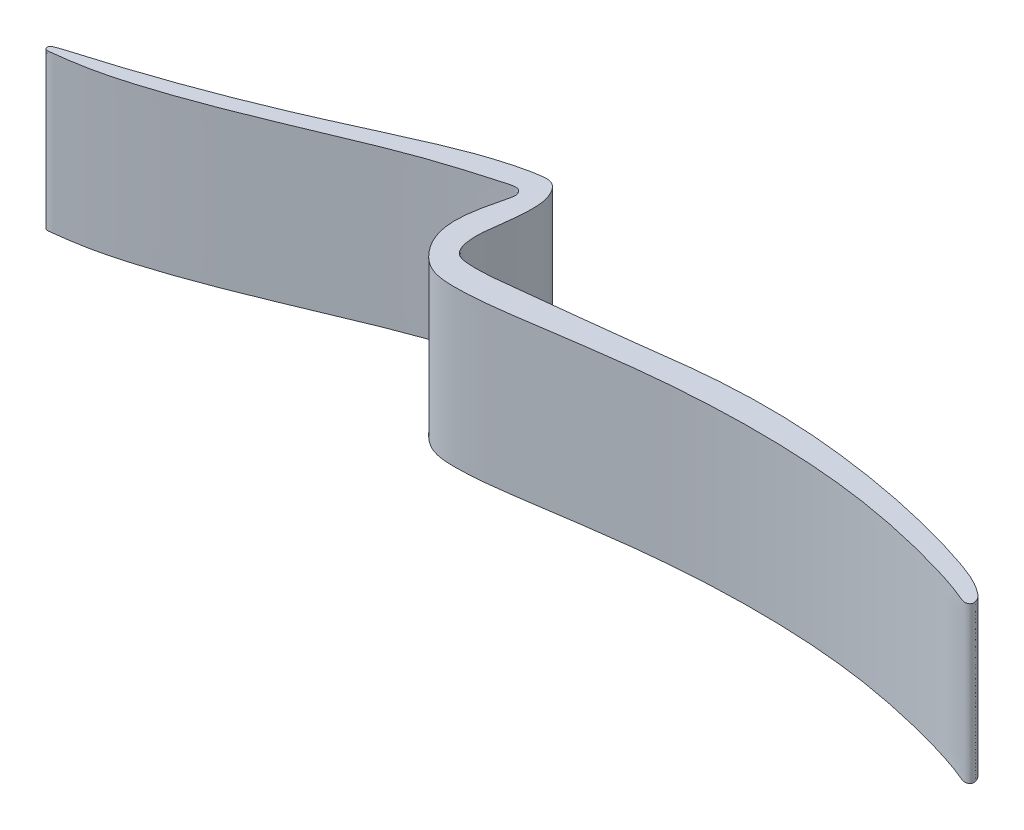
ISO-10303-21;
HEADER;
FILE_DESCRIPTION(('STEP AP214'),'2;1');
FILE_NAME('part.step','',(''),(''),'','','');
FILE_SCHEMA(('AUTOMOTIVE_DESIGN { 1 0 10303 214 1 1 1 1 }'));
ENDSEC;
DATA;
#1=APPLICATION_CONTEXT('core data for automotive mechanical design processes');
#2=APPLICATION_PROTOCOL_DEFINITION('international standard','automotive_design',2000,#1);
#3=PRODUCT_CONTEXT('',#1,'mechanical');
#4=PRODUCT('Part','Part','',(#3));
#5=PRODUCT_RELATED_PRODUCT_CATEGORY('part','',(#4));
#6=PRODUCT_DEFINITION_FORMATION('','',#4);
#7=PRODUCT_DEFINITION_CONTEXT('part definition',#1,'design');
#8=PRODUCT_DEFINITION('design','',#6,#7);
#9=PRODUCT_DEFINITION_SHAPE('','',#8);
#10=(LENGTH_UNIT() NAMED_UNIT(*) SI_UNIT(.MILLI.,.METRE.));
#11=(NAMED_UNIT(*) PLANE_ANGLE_UNIT() SI_UNIT($,.RADIAN.));
#12=(NAMED_UNIT(*) SI_UNIT($,.STERADIAN.) SOLID_ANGLE_UNIT());
#13=UNCERTAINTY_MEASURE_WITH_UNIT(LENGTH_MEASURE(1.E-05),#10,'distance_accuracy_value','');
#14=(GEOMETRIC_REPRESENTATION_CONTEXT(3) GLOBAL_UNCERTAINTY_ASSIGNED_CONTEXT((#13)) GLOBAL_UNIT_ASSIGNED_CONTEXT((#10,
#11,#12)) REPRESENTATION_CONTEXT('',''));
#15=CARTESIAN_POINT('',(0.,0.,0.));
#16=DIRECTION('',(0.,0.,1.));
#17=DIRECTION('',(1.,0.,0.));
#18=AXIS2_PLACEMENT_3D('',#15,#16,#17);
#19=CARTESIAN_POINT('',(1.65448152690675,12.7,-44.8777768456388));
#20=CARTESIAN_POINT('',(1.36465364201029,12.7,-44.7928073225051));
#21=CARTESIAN_POINT('',(1.00860403780542,12.7,-44.6897094424693));
#22=CARTESIAN_POINT('',(0.58561976009421,12.7,-44.4655987481473));
#23=CARTESIAN_POINT('',(0.568742883309651,12.7,-44.0072406524502));
#24=CARTESIAN_POINT('',(2.30123530692525,12.7,-44.2419974810909));
#25=CARTESIAN_POINT('',(4.86360351406783,12.7,-44.6302387244206));
#26=CARTESIAN_POINT('',(10.3962542808785,12.7,-46.3784289953838));
#27=CARTESIAN_POINT('',(16.8028474575681,12.7,-49.0190361924279));
#28=CARTESIAN_POINT('',(23.3020541518229,12.7,-51.7986355810191));
#29=CARTESIAN_POINT('',(27.3908638963233,12.7,-52.973458402482));
#30=CARTESIAN_POINT('',(29.8168797929006,12.7,-53.6614955331135));
#31=CARTESIAN_POINT('',(30.2115840660536,12.7,-53.0102957510749));
#32=CARTESIAN_POINT('',(29.9334566616149,12.7,-51.7932983866571));
#33=CARTESIAN_POINT('',(29.4296372956175,12.7,-49.9521084687263));
#34=CARTESIAN_POINT('',(29.3863839798694,12.7,-47.339398243731));
#35=CARTESIAN_POINT('',(30.4591398465766,12.7,-45.4103427843255));
#36=CARTESIAN_POINT('',(32.1115986485048,12.7,-44.0324624510583));
#37=CARTESIAN_POINT('',(35.1035886389103,12.7,-43.8950431431731));
#38=CARTESIAN_POINT('',(40.1210220004968,12.7,-44.5598013586339));
#39=CARTESIAN_POINT('',(48.08835339061,12.7,-45.8588296800691));
#40=CARTESIAN_POINT('',(56.9362214779107,12.7,-46.3207038197667));
#41=CARTESIAN_POINT('',(64.9308115665983,12.7,-45.7287658409869));
#42=CARTESIAN_POINT('',(70.3768836423629,12.7,-44.647592218191));
#43=CARTESIAN_POINT('',(74.2069488116154,12.7,-43.5886005568641));
#44=CARTESIAN_POINT('',(76.2385414806979,12.7,-42.8670840376108));
#45=CARTESIAN_POINT('',(77.1654430806628,12.7,-42.4601111412802));
#46=CARTESIAN_POINT('',(77.7271553702591,12.7,-42.6730789510665));
#47=CARTESIAN_POINT('',(77.4761533532036,12.7,-43.3416864618733));
#48=CARTESIAN_POINT('',(76.2987637059603,12.7,-44.3561385018245));
#49=CARTESIAN_POINT('',(71.9486689878946,12.7,-45.9431770334858));
#50=CARTESIAN_POINT('',(65.4695286712503,12.7,-47.4536047307781));
#51=CARTESIAN_POINT('',(57.6787586589409,12.7,-48.3597062211256));
#52=CARTESIAN_POINT('',(50.6416625112191,12.7,-48.1684483417873));
#53=CARTESIAN_POINT('',(44.6562299535149,12.7,-47.261557887244));
#54=CARTESIAN_POINT('',(40.1402955675058,12.7,-46.7941269590125));
#55=CARTESIAN_POINT('',(36.6262400544598,12.7,-46.4259487281022));
#56=CARTESIAN_POINT('',(34.3313876387701,12.7,-46.0721574950159));
#57=CARTESIAN_POINT('',(32.6313552640268,12.7,-46.207302373221));
#58=CARTESIAN_POINT('',(32.0497520316113,12.7,-46.4019381953179));
#59=CARTESIAN_POINT('',(31.6200447406106,12.7,-46.9357139876739));
#60=CARTESIAN_POINT('',(31.2894226195716,12.7,-48.292053403314));
#61=CARTESIAN_POINT('',(31.5738305627877,12.7,-50.2024616415007));
#62=CARTESIAN_POINT('',(31.8408486984842,12.7,-52.4462000958077));
#63=CARTESIAN_POINT('',(31.712557284274,12.7,-54.2420498005537));
#64=CARTESIAN_POINT('',(30.7521404135882,12.7,-55.4858166732728));
#65=CARTESIAN_POINT('',(29.465279186695,12.7,-55.3306287510555));
#66=CARTESIAN_POINT('',(27.6441886617191,12.7,-54.922005934138));
#67=CARTESIAN_POINT('',(25.3143200155334,12.7,-54.1843378959923));
#68=CARTESIAN_POINT('',(21.279830864265,12.7,-52.4790282423092));
#69=CARTESIAN_POINT('',(15.0607249143862,12.7,-49.5487648541491));
#70=CARTESIAN_POINT('',(8.04415082530332,12.7,-46.8375903276152));
#71=CARTESIAN_POINT('',(3.10747245529795,12.7,-45.303753615773));
#72=CARTESIAN_POINT('',(1.65448152690675,12.7,-44.8777768456388));
#73=B_SPLINE_CURVE_WITH_KNOTS('',3,(#19,#20,#21,#22,#23,#24,#25,#26,#27,#28,#29,#30,#31,#32,#33,
#34,#35,#36,#37,#38,#39,#40,#41,#42,#43,#44,#45,#46,#47,#48,#49,#50,#51,#52,#53,#54,#55,#56,#57,
#58,#59,#60,#61,#62,#63,#64,#65,#66,#67,#68,#69,#70,#71,#72),.UNSPECIFIED.,.T.,.F.,(4,1,1,1,1,1,
1,1,1,1,1,1,1,1,1,1,1,1,1,1,1,1,1,1,1,1,1,1,1,1,1,1,1,1,1,1,1,1,1,1,1,1,1,1,1,1,1,1,1,1,1,4),
(0.,0.00525552322238743,0.00649172465980663,0.00758505080483951,0.0117653737871402,
0.0274596190311394,0.0620078038810136,0.103345590596982,0.149552654926368,0.177802812973673,
0.183365828963613,0.185957045634314,0.189099039583891,0.20405914972177,0.219160765252696,
0.232013650813093,0.24044824378705,0.254724455317923,0.280636254754286,0.327966070522375,
0.391809992254298,0.431543060210777,0.464383019741735,0.486528237317803,0.499048155035459,
0.501563937932077,0.503399240688489,0.507752844702153,0.509861625616756,0.530978762318791,
0.583204999591088,0.625317742779398,0.663911473649287,0.703059484904931,0.728549037732843,
0.741355415065659,0.763449574433018,0.767796751191346,0.770427832679449,0.77363911148301,
0.778954607489902,0.79378845351641,0.806063711721861,0.817692577999034,0.823929064036825,
0.829937356247752,0.837965042220084,0.856582293248673,0.871098545621326,0.91286315142911,
0.973652543581836,1.),.UNSPECIFIED.);
#74=DIRECTION('',(0.,-1.,0.));
#75=VECTOR('',#74,1.);
#76=SURFACE_OF_LINEAR_EXTRUSION('',#73,#75);
#77=CARTESIAN_POINT('',(1.65448152690675,12.7,-44.8777768456388));
#78=VERTEX_POINT('',#77);
#79=EDGE_CURVE('E10',#78,#78,#73,.T.);
#80=ORIENTED_EDGE('',*,*,#79,.F.);
#81=EDGE_LOOP('',(#80));
#82=FACE_BOUND('',#81,.T.);
#83=CARTESIAN_POINT('',(1.65448152690675,0.,-44.8777768456388));
#84=CARTESIAN_POINT('',(1.36465364201029,0.,-44.7928073225051));
#85=CARTESIAN_POINT('',(1.00860403780542,0.,-44.6897094424693));
#86=CARTESIAN_POINT('',(0.58561976009421,0.,-44.4655987481473));
#87=CARTESIAN_POINT('',(0.568742883309651,0.,-44.0072406524502));
#88=CARTESIAN_POINT('',(2.30123530692525,0.,-44.2419974810909));
#89=CARTESIAN_POINT('',(4.86360351406783,0.,-44.6302387244206));
#90=CARTESIAN_POINT('',(10.3962542808785,0.,-46.3784289953838));
#91=CARTESIAN_POINT('',(16.8028474575681,0.,-49.0190361924279));
#92=CARTESIAN_POINT('',(23.3020541518229,0.,-51.7986355810191));
#93=CARTESIAN_POINT('',(27.3908638963233,0.,-52.973458402482));
#94=CARTESIAN_POINT('',(29.8168797929006,0.,-53.6614955331135));
#95=CARTESIAN_POINT('',(30.2115840660536,0.,-53.0102957510749));
#96=CARTESIAN_POINT('',(29.9334566616149,0.,-51.7932983866571));
#97=CARTESIAN_POINT('',(29.4296372956175,0.,-49.9521084687263));
#98=CARTESIAN_POINT('',(29.3863839798694,0.,-47.339398243731));
#99=CARTESIAN_POINT('',(30.4591398465766,0.,-45.4103427843255));
#100=CARTESIAN_POINT('',(32.1115986485048,0.,-44.0324624510583));
#101=CARTESIAN_POINT('',(35.1035886389103,0.,-43.8950431431731));
#102=CARTESIAN_POINT('',(40.1210220004968,0.,-44.5598013586339));
#103=CARTESIAN_POINT('',(48.08835339061,0.,-45.8588296800691));
#104=CARTESIAN_POINT('',(56.9362214779107,0.,-46.3207038197667));
#105=CARTESIAN_POINT('',(64.9308115665983,0.,-45.7287658409869));
#106=CARTESIAN_POINT('',(70.3768836423629,0.,-44.647592218191));
#107=CARTESIAN_POINT('',(74.2069488116154,0.,-43.5886005568641));
#108=CARTESIAN_POINT('',(76.2385414806979,0.,-42.8670840376108));
#109=CARTESIAN_POINT('',(77.1654430806628,0.,-42.4601111412802));
#110=CARTESIAN_POINT('',(77.7271553702591,0.,-42.6730789510665));
#111=CARTESIAN_POINT('',(77.4761533532036,0.,-43.3416864618733));
#112=CARTESIAN_POINT('',(76.2987637059603,0.,-44.3561385018245));
#113=CARTESIAN_POINT('',(71.9486689878946,0.,-45.9431770334858));
#114=CARTESIAN_POINT('',(65.4695286712503,0.,-47.4536047307781));
#115=CARTESIAN_POINT('',(57.6787586589409,0.,-48.3597062211256));
#116=CARTESIAN_POINT('',(50.6416625112191,0.,-48.1684483417873));
#117=CARTESIAN_POINT('',(44.6562299535149,0.,-47.261557887244));
#118=CARTESIAN_POINT('',(40.1402955675058,0.,-46.7941269590125));
#119=CARTESIAN_POINT('',(36.6262400544598,0.,-46.4259487281022));
#120=CARTESIAN_POINT('',(34.3313876387701,0.,-46.0721574950159));
#121=CARTESIAN_POINT('',(32.6313552640268,0.,-46.207302373221));
#122=CARTESIAN_POINT('',(32.0497520316113,0.,-46.4019381953179));
#123=CARTESIAN_POINT('',(31.6200447406106,0.,-46.9357139876739));
#124=CARTESIAN_POINT('',(31.2894226195716,0.,-48.292053403314));
#125=CARTESIAN_POINT('',(31.5738305627877,0.,-50.2024616415007));
#126=CARTESIAN_POINT('',(31.8408486984842,0.,-52.4462000958077));
#127=CARTESIAN_POINT('',(31.712557284274,0.,-54.2420498005537));
#128=CARTESIAN_POINT('',(30.7521404135882,0.,-55.4858166732728));
#129=CARTESIAN_POINT('',(29.465279186695,0.,-55.3306287510555));
#130=CARTESIAN_POINT('',(27.6441886617191,0.,-54.922005934138));
#131=CARTESIAN_POINT('',(25.3143200155334,0.,-54.1843378959923));
#132=CARTESIAN_POINT('',(21.279830864265,0.,-52.4790282423092));
#133=CARTESIAN_POINT('',(15.0607249143862,0.,-49.5487648541491));
#134=CARTESIAN_POINT('',(8.04415082530332,0.,-46.8375903276152));
#135=CARTESIAN_POINT('',(3.10747245529795,0.,-45.303753615773));
#136=CARTESIAN_POINT('',(1.65448152690675,0.,-44.8777768456388));
#137=B_SPLINE_CURVE_WITH_KNOTS('',3,(#83,#84,#85,#86,#87,#88,#89,#90,#91,#92,#93,#94,#95,#96,
#97,#98,#99,#100,#101,#102,#103,#104,#105,#106,#107,#108,#109,#110,#111,#112,#113,#114,#115,
#116,#117,#118,#119,#120,#121,#122,#123,#124,#125,#126,#127,#128,#129,#130,#131,#132,#133,#134,
#135,#136),.UNSPECIFIED.,.T.,.F.,(4,1,1,1,1,1,1,1,1,1,1,1,1,1,1,1,1,1,1,1,1,1,1,1,1,1,1,1,1,1,1,
1,1,1,1,1,1,1,1,1,1,1,1,1,1,1,1,1,1,1,1,4),(0.,0.00525552322238743,0.00649172465980663,
0.00758505080483951,0.0117653737871402,0.0274596190311394,0.0620078038810136,0.103345590596982,
0.149552654926368,0.177802812973673,0.183365828963613,0.185957045634314,0.189099039583891,
0.20405914972177,0.219160765252696,0.232013650813093,0.24044824378705,0.254724455317923,
0.280636254754286,0.327966070522375,0.391809992254298,0.431543060210777,0.464383019741735,
0.486528237317803,0.499048155035459,0.501563937932077,0.503399240688489,0.507752844702153,
0.509861625616756,0.530978762318791,0.583204999591088,0.625317742779398,0.663911473649287,
0.703059484904931,0.728549037732843,0.741355415065659,0.763449574433018,0.767796751191346,
0.770427832679449,0.77363911148301,0.778954607489902,0.79378845351641,0.806063711721861,
0.817692577999034,0.823929064036825,0.829937356247752,0.837965042220084,0.856582293248673,
0.871098545621326,0.91286315142911,0.973652543581836,1.),.UNSPECIFIED.);
#138=CARTESIAN_POINT('',(1.65448152690675,0.,-44.8777768456388));
#139=VERTEX_POINT('',#138);
#140=EDGE_CURVE('E41',#139,#139,#137,.T.);
#141=ORIENTED_EDGE('',*,*,#140,.T.);
#142=EDGE_LOOP('',(#141));
#143=FACE_BOUND('',#142,.T.);
#144=ADVANCED_FACE('F37',(#82,#143),#76,.F.);
#145=CARTESIAN_POINT('',(76.9458441307928,12.7,-42.5602259305091));
#146=DIRECTION('',(0.,-1.,0.));
#147=DIRECTION('',(0.,0.,-1.));
#148=AXIS2_PLACEMENT_3D('',#145,#146,#147);
#149=PLANE('',#148);
#150=ORIENTED_EDGE('',*,*,#79,.T.);
#151=EDGE_LOOP('',(#150));
#152=FACE_BOUND('',#151,.T.);
#153=ADVANCED_FACE('F60',(#152),#149,.F.);
#154=CARTESIAN_POINT('',(76.9458441307928,0.,-42.5602259305091));
#155=DIRECTION('',(0.,-1.,0.));
#156=DIRECTION('',(0.,0.,-1.));
#157=AXIS2_PLACEMENT_3D('',#154,#155,#156);
#158=PLANE('',#157);
#159=ORIENTED_EDGE('',*,*,#140,.F.);
#160=EDGE_LOOP('',(#159));
#161=FACE_BOUND('',#160,.T.);
#162=ADVANCED_FACE('F58',(#161),#158,.T.);
#163=CLOSED_SHELL('',(#144,#153,#162));
#164=MANIFOLD_SOLID_BREP('B2',#163);
#165=ADVANCED_BREP_SHAPE_REPRESENTATION('',(#18,#164),#14);
#166=SHAPE_DEFINITION_REPRESENTATION(#9,#165);
ENDSEC;
END-ISO-10303-21;
